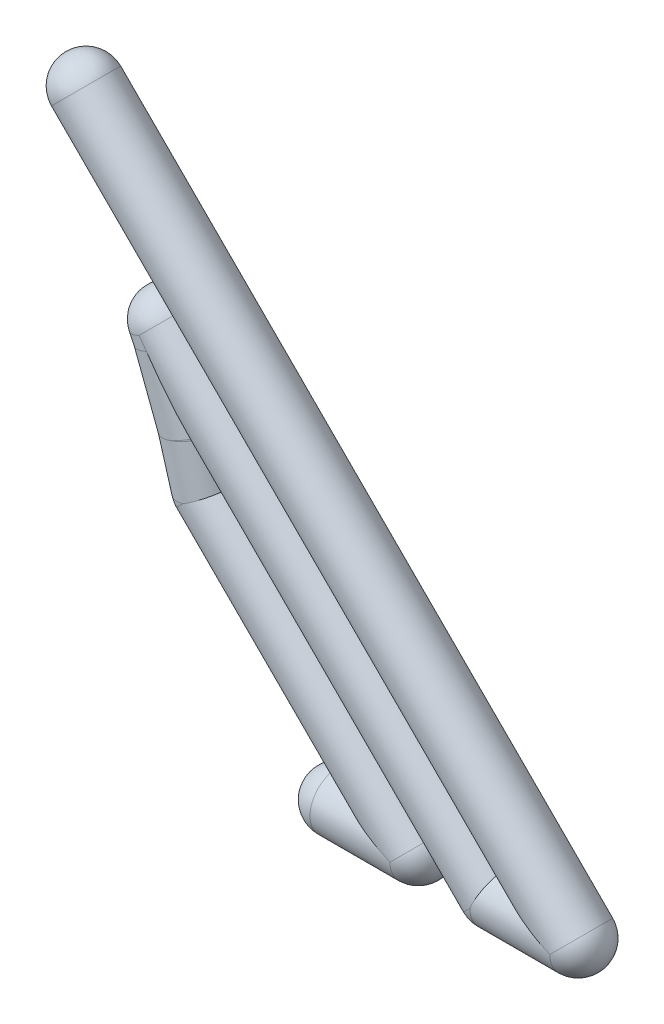
ISO-10303-21;
HEADER;
FILE_DESCRIPTION(('STEP AP214'),'2;1');
FILE_NAME('part.step','',(''),(''),'','','');
FILE_SCHEMA(('AUTOMOTIVE_DESIGN { 1 0 10303 214 1 1 1 1 }'));
ENDSEC;
DATA;
#1=APPLICATION_CONTEXT('core data for automotive mechanical design processes');
#2=APPLICATION_PROTOCOL_DEFINITION('international standard','automotive_design',2000,#1);
#3=PRODUCT_CONTEXT('',#1,'mechanical');
#4=PRODUCT('Part','Part','',(#3));
#5=PRODUCT_RELATED_PRODUCT_CATEGORY('part','',(#4));
#6=PRODUCT_DEFINITION_FORMATION('','',#4);
#7=PRODUCT_DEFINITION_CONTEXT('part definition',#1,'design');
#8=PRODUCT_DEFINITION('design','',#6,#7);
#9=PRODUCT_DEFINITION_SHAPE('','',#8);
#10=(LENGTH_UNIT() NAMED_UNIT(*) SI_UNIT(.MILLI.,.METRE.));
#11=(NAMED_UNIT(*) PLANE_ANGLE_UNIT() SI_UNIT($,.RADIAN.));
#12=(NAMED_UNIT(*) SI_UNIT($,.STERADIAN.) SOLID_ANGLE_UNIT());
#13=UNCERTAINTY_MEASURE_WITH_UNIT(LENGTH_MEASURE(1.E-05),#10,'distance_accuracy_value','');
#14=(GEOMETRIC_REPRESENTATION_CONTEXT(3) GLOBAL_UNCERTAINTY_ASSIGNED_CONTEXT((#13)) GLOBAL_UNIT_ASSIGNED_CONTEXT((#10,
#11,#12)) REPRESENTATION_CONTEXT('',''));
#15=CARTESIAN_POINT('',(0.,0.,0.));
#16=DIRECTION('',(0.,0.,1.));
#17=DIRECTION('',(1.,0.,0.));
#18=AXIS2_PLACEMENT_3D('',#15,#16,#17);
#19=CARTESIAN_POINT('',(11.603,-12.315,0.375));
#20=DIRECTION('',(1.,0.,0.));
#21=DIRECTION('',(0.,-1.,0.));
#22=AXIS2_PLACEMENT_3D('',#19,#20,#21);
#23=SPHERICAL_SURFACE('',#22,0.24);
#24=CARTESIAN_POINT('',(11.603,-12.315,0.375));
#25=DIRECTION('',(-0.707106781186547,0.707106781186548,0.));
#26=DIRECTION('',(-0.707106781186548,-0.707106781186547,0.));
#27=AXIS2_PLACEMENT_3D('',#24,#25,#26);
#28=SPHERICAL_SURFACE('',#27,0.24);
#29=CARTESIAN_POINT('',(11.603,-12.315,0.375));
#30=DIRECTION('',(-0.707106781186547,0.707106781186548,0.));
#31=DIRECTION('',(-0.707106781186548,-0.707106781186547,0.));
#32=AXIS2_PLACEMENT_3D('',#29,#30,#31);
#33=CIRCLE('',#32,0.24);
#34=CARTESIAN_POINT('',(11.4332943725152,-12.4847056274848,0.375));
#35=VERTEX_POINT('',#34);
#36=EDGE_CURVE('E88',#35,#35,#33,.F.);
#37=ORIENTED_EDGE('',*,*,#36,.F.);
#38=EDGE_LOOP('',(#37));
#39=FACE_BOUND('',#38,.T.);
#40=ADVANCED_FACE('F81',(#39),#28,.T.);
#41=CARTESIAN_POINT('',(15.78,-16.492,0.375));
#42=DIRECTION('',(-0.707106781186547,0.707106781186548,0.));
#43=DIRECTION('',(-0.707106781186548,-0.707106781186547,0.));
#44=AXIS2_PLACEMENT_3D('',#41,#42,#43);
#45=CYLINDRICAL_SURFACE('',#44,0.24);
#46=CARTESIAN_POINT('',(15.78,-16.492,0.375));
#47=DIRECTION('',(0.38268343236509,0.923879532511287,0.));
#48=DIRECTION('',(-0.923879532511287,0.38268343236509,0.));
#49=AXIS2_PLACEMENT_3D('',#46,#47,#48);
#50=ELLIPSE('',#49,0.627150223140661,0.24);
#51=CARTESIAN_POINT('',(15.78,-16.492,0.615));
#52=VERTEX_POINT('',#51);
#53=CARTESIAN_POINT('',(15.78,-16.492,0.135));
#54=VERTEX_POINT('',#53);
#55=EDGE_CURVE('E12',#52,#54,#50,.F.);
#56=ORIENTED_EDGE('',*,*,#55,.F.);
#57=CARTESIAN_POINT('',(15.78,-16.492,0.375));
#58=DIRECTION('',(-0.707106781186548,0.707106781186547,0.));
#59=DIRECTION('',(-0.707106781186547,-0.707106781186548,0.));
#60=AXIS2_PLACEMENT_3D('',#57,#58,#59);
#61=CIRCLE('',#60,0.24);
#62=EDGE_CURVE('E95',#52,#54,#61,.T.);
#63=ORIENTED_EDGE('',*,*,#62,.T.);
#64=EDGE_LOOP('',(#56,#63));
#65=FACE_BOUND('',#64,.T.);
#66=ORIENTED_EDGE('',*,*,#36,.T.);
#67=EDGE_LOOP('',(#66));
#68=FACE_BOUND('',#67,.T.);
#69=ADVANCED_FACE('F352',(#65,#68),#45,.T.);
#70=CARTESIAN_POINT('',(15.78,-16.492,0.375));
#71=DIRECTION('',(1.,0.,0.));
#72=DIRECTION('',(0.,-1.,0.));
#73=AXIS2_PLACEMENT_3D('',#70,#71,#72);
#74=SPHERICAL_SURFACE('',#73,0.24);
#75=ORIENTED_EDGE('',*,*,#62,.F.);
#76=CARTESIAN_POINT('',(15.78,-16.492,0.375));
#77=DIRECTION('',(1.,0.,0.));
#78=DIRECTION('',(0.,0.,-1.));
#79=AXIS2_PLACEMENT_3D('',#76,#77,#78);
#80=CIRCLE('',#79,0.24);
#81=EDGE_CURVE('E340',#54,#52,#80,.F.);
#82=ORIENTED_EDGE('',*,*,#81,.F.);
#83=EDGE_LOOP('',(#75,#82));
#84=FACE_BOUND('',#83,.T.);
#85=ADVANCED_FACE('F358',(#84),#74,.T.);
#86=CARTESIAN_POINT('',(15.101,-16.492,0.375));
#87=DIRECTION('',(1.,0.,0.));
#88=DIRECTION('',(0.,0.,-1.));
#89=AXIS2_PLACEMENT_3D('',#86,#87,#88);
#90=CYLINDRICAL_SURFACE('',#89,0.24);
#91=CARTESIAN_POINT('',(15.101,-16.492,0.375));
#92=DIRECTION('',(0.923879532511287,-0.38268343236509,0.));
#93=DIRECTION('',(0.38268343236509,0.923879532511287,0.));
#94=AXIS2_PLACEMENT_3D('',#91,#92,#93);
#95=ELLIPSE('',#94,0.259774128070175,0.24);
#96=CARTESIAN_POINT('',(15.101,-16.492,0.615));
#97=VERTEX_POINT('',#96);
#98=CARTESIAN_POINT('',(15.101,-16.492,0.135));
#99=VERTEX_POINT('',#98);
#100=EDGE_CURVE('E345',#97,#99,#95,.F.);
#101=ORIENTED_EDGE('',*,*,#100,.F.);
#102=CARTESIAN_POINT('',(15.101,-16.492,0.375));
#103=DIRECTION('',(1.,0.,0.));
#104=DIRECTION('',(0.,0.,-1.));
#105=AXIS2_PLACEMENT_3D('',#102,#103,#104);
#106=CIRCLE('',#105,0.24);
#107=EDGE_CURVE('E339',#97,#99,#106,.T.);
#108=ORIENTED_EDGE('',*,*,#107,.T.);
#109=EDGE_LOOP('',(#101,#108));
#110=FACE_BOUND('',#109,.T.);
#111=ORIENTED_EDGE('',*,*,#81,.T.);
#112=ORIENTED_EDGE('',*,*,#55,.T.);
#113=EDGE_LOOP('',(#111,#112));
#114=FACE_BOUND('',#113,.T.);
#115=ADVANCED_FACE('F362',(#110,#114),#90,.T.);
#116=CARTESIAN_POINT('',(15.101,-16.492,0.375));
#117=DIRECTION('',(1.,0.,0.));
#118=DIRECTION('',(0.,-1.,0.));
#119=AXIS2_PLACEMENT_3D('',#116,#117,#118);
#120=SPHERICAL_SURFACE('',#119,0.24);
#121=ORIENTED_EDGE('',*,*,#107,.F.);
#122=CARTESIAN_POINT('',(15.101,-16.492,0.375));
#123=DIRECTION('',(0.707106781186548,-0.707106781186547,0.));
#124=DIRECTION('',(0.707106781186547,0.707106781186548,0.));
#125=AXIS2_PLACEMENT_3D('',#122,#123,#124);
#126=CIRCLE('',#125,0.24);
#127=EDGE_CURVE('E229',#99,#97,#126,.F.);
#128=ORIENTED_EDGE('',*,*,#127,.F.);
#129=EDGE_LOOP('',(#121,#128));
#130=FACE_BOUND('',#129,.T.);
#131=ADVANCED_FACE('F367',(#130),#120,.T.);
#132=CARTESIAN_POINT('',(12.293,-13.684,0.375));
#133=DIRECTION('',(0.707106781186548,-0.707106781186547,0.));
#134=DIRECTION('',(0.707106781186547,0.707106781186548,0.));
#135=AXIS2_PLACEMENT_3D('',#132,#133,#134);
#136=CYLINDRICAL_SURFACE('',#135,0.24);
#137=CARTESIAN_POINT('',(14.9315482287431,-16.6614517712569,0.388122287750447));
#138=CARTESIAN_POINT('',(14.8750762374142,-16.6049958479422,0.387917976856971));
#139=CARTESIAN_POINT('',(14.8186041785029,-16.5485398545911,0.387704029631473));
#140=CARTESIAN_POINT('',(14.7054513690829,-16.4354192333862,0.387263843036514));
#141=CARTESIAN_POINT('',(14.6487706186599,-16.3787546056097,0.387037561159029));
#142=CARTESIAN_POINT('',(14.478339762828,-16.208372228883,0.386351621331153));
#143=CARTESIAN_POINT('',(14.3645899349614,-16.0946547580285,0.385886383658709));
#144=CARTESIAN_POINT('',(14.1371683858608,-15.8672979002828,0.384758742685581));
#145=CARTESIAN_POINT('',(14.0234966658242,-15.7536585145892,0.384096477956337));
#146=CARTESIAN_POINT('',(13.7973951645419,-15.5276213288395,0.383073425610083));
#147=CARTESIAN_POINT('',(13.6849653045821,-15.4152234500906,0.382709441510488));
#148=CARTESIAN_POINT('',(13.45976146334,-15.1900836691241,0.380109317611419));
#149=CARTESIAN_POINT('',(13.3469874126026,-15.0773416974711,0.377867857259473));
#150=CARTESIAN_POINT('',(13.2059833589703,-14.9363777530824,0.377917305846484));
#151=CARTESIAN_POINT('',(13.1777055776379,-14.9081080154938,0.378070801474246));
#152=CARTESIAN_POINT('',(13.1489610929394,-14.8793717072949,0.375470068229033));
#153=CARTESIAN_POINT('',(13.1485086663535,-14.8789194094038,0.375428440231718));
#154=CARTESIAN_POINT('',(13.1478428067681,-14.8782537392252,0.375329330243708));
#155=CARTESIAN_POINT('',(13.1476261233747,-14.8780371174684,0.375291011495398));
#156=CARTESIAN_POINT('',(13.1471902403786,-14.8776013584612,0.375228409359514));
#157=CARTESIAN_POINT('',(13.1469712543874,-14.8773824347616,0.375203785463772));
#158=CARTESIAN_POINT('',(13.1467735547008,-14.8771847913115,0.375078882046712));
#159=CARTESIAN_POINT('',(13.1467711905827,-14.8771824278659,0.375077371727318));
#160=CARTESIAN_POINT('',(13.1467664738125,-14.8771777124375,0.375074315793714));
#161=CARTESIAN_POINT('',(13.146764121163,-14.8771753604572,0.375072770172318));
#162=CARTESIAN_POINT('',(13.1467570765487,-14.8771683178467,0.375068032536357));
#163=CARTESIAN_POINT('',(13.1467524142363,-14.8771636568605,0.375064749720251));
#164=CARTESIAN_POINT('',(13.1467431130988,-14.8771543583688,0.375057643069673));
#165=CARTESIAN_POINT('',(13.1467384792103,-14.8771497257984,0.375053805918599));
#166=CARTESIAN_POINT('',(13.1467296514229,-14.8771409005221,0.375045242238543));
#167=CARTESIAN_POINT('',(13.1467254548195,-14.8771367051125,0.375040521752456));
#168=CARTESIAN_POINT('',(13.1467203244988,-14.8771315762511,0.375033307162306));
#169=CARTESIAN_POINT('',(13.1467190267829,-14.8771302789044,0.375031331293022));
#170=CARTESIAN_POINT('',(13.1467165770812,-14.8771278298995,0.375027195024072));
#171=CARTESIAN_POINT('',(13.1467154254772,-14.877126678623,0.375025034164695));
#172=CARTESIAN_POINT('',(13.1467133076084,-14.8771245613567,0.375020497333478));
#173=CARTESIAN_POINT('',(13.1467123436951,-14.8771235977176,0.37501811912103));
#174=CARTESIAN_POINT('',(13.1467107281527,-14.8771219826347,0.375013160361962));
#175=CARTESIAN_POINT('',(13.1467100750083,-14.8771213296762,0.375010580869919));
#176=CARTESIAN_POINT('',(13.1467093300799,-14.8771205849596,0.375006011804161));
#177=CARTESIAN_POINT('',(13.1467091329237,-14.8771203878595,0.3750040567046));
#178=CARTESIAN_POINT('',(13.1467089711055,-14.8771202260873,0.375000126074439));
#179=CARTESIAN_POINT('',(13.146709006547,-14.8771202615187,0.374998150535128));
#180=CARTESIAN_POINT('',(13.14670931751,-14.8771205723933,0.374994244354865));
#181=CARTESIAN_POINT('',(13.1467095923101,-14.8771208471153,0.374992313596891));
#182=CARTESIAN_POINT('',(13.1467103429324,-14.877121597524,0.374988533592562));
#183=CARTESIAN_POINT('',(13.1467108188649,-14.8771220733212,0.374986684391649));
#184=CARTESIAN_POINT('',(13.1467122511948,-14.8771235052436,0.37498209352165));
#185=CARTESIAN_POINT('',(13.1467133276119,-14.8771245813545,0.374979427073381));
#186=CARTESIAN_POINT('',(13.1467157523752,-14.8771270054281,0.374974356399019));
#187=CARTESIAN_POINT('',(13.146717101575,-14.8771283542441,0.374971953033475));
#188=CARTESIAN_POINT('',(13.1467220168944,-14.8771332681654,0.374964076804209));
#189=CARTESIAN_POINT('',(13.1467259965706,-14.8771372467094,0.374959123777026));
#190=CARTESIAN_POINT('',(13.1467344471684,-14.8771456949035,0.374950148115432));
#191=CARTESIAN_POINT('',(13.1467389212037,-14.8771501676661,0.3749461319391));
#192=CARTESIAN_POINT('',(13.1467602700502,-14.8771715104398,0.374928256485313));
#193=CARTESIAN_POINT('',(13.1467781893365,-14.877189424629,0.374916919257417));
#194=CARTESIAN_POINT('',(13.1468148713317,-14.8772260961897,0.374897677522705));
#195=CARTESIAN_POINT('',(13.1468336365081,-14.8772448560283,0.374889783887153));
#196=CARTESIAN_POINT('',(13.1470012760865,-14.8774124479209,0.374823181562309));
#197=CARTESIAN_POINT('',(13.1471545481204,-14.8775656763559,0.3747896406223));
#198=CARTESIAN_POINT('',(13.1479196883627,-14.8783305989505,0.37463945731144));
#199=CARTESIAN_POINT('',(13.1485339536009,-14.8789446894581,0.374573826002209));
#200=CARTESIAN_POINT('',(13.1516049869237,-14.8820148492115,0.374278312428002));
#201=CARTESIAN_POINT('',(13.1540670609565,-14.8844762228962,0.374145588736593));
#202=CARTESIAN_POINT('',(13.1663755225631,-14.8967811833048,0.373549215720243));
#203=CARTESIAN_POINT('',(13.1762222988036,-14.906625158585,0.373286917528214));
#204=CARTESIAN_POINT('',(13.2254570188469,-14.955845873588,0.37210546644178));
#205=CARTESIAN_POINT('',(13.2648535421154,-14.9952311903362,0.371576244967009));
#206=CARTESIAN_POINT('',(13.4618323480808,-15.1921539647834,0.369195627459563));
#207=CARTESIAN_POINT('',(13.6194092453457,-15.3496860385828,0.368140606235355));
#208=CARTESIAN_POINT('',(14.1618083090038,-15.8919308143571,0.364903948852689));
#209=CARTESIAN_POINT('',(14.5466399576362,-16.2766529958718,0.363291662857187));
#210=CARTESIAN_POINT('',(14.9314940955856,-16.6613976603133,0.361877999102051));
#211=CARTESIAN_POINT('',(14.9315211605413,-16.6614247175703,0.361877899686805));
#212=CARTESIAN_POINT('',(14.9315482254971,-16.6614517748273,0.361877800272542));
#213=B_SPLINE_CURVE_WITH_KNOTS('',3,(#137,#138,#139,#140,#141,#142,#143,#144,#145,#146,#147,
#148,#149,#150,#151,#152,#153,#154,#155,#156,#157,#158,#159,#160,#161,#162,#163,#164,#165,#166,
#167,#168,#169,#170,#171,#172,#173,#174,#175,#176,#177,#178,#179,#180,#181,#182,#183,#184,#185,
#186,#187,#188,#189,#190,#191,#192,#193,#194,#195,#196,#197,#198,#199,#200,#201,#202,#203,#204,
#205,#206,#207,#208,#209,#210,#211,#212),.UNSPECIFIED.,.F.,.F.,(4,2,2,2,2,2,2,2,2,2,2,2,2,2,2,2,
2,2,2,2,2,2,2,2,2,2,2,2,2,2,2,2,2,2,2,2,2,4),(0.,0.239557313620775,0.4800000057718,
0.962535040171978,1.44473150109493,1.92169038739399,2.40000551157326,2.52000957530604,
2.52192857969255,2.5228606812891,2.52376843269858,2.52377943542771,2.52379044041686,
2.52381252578302,2.52383527631846,2.52385787655869,2.5238659559146,2.5238740559658,
2.52388225175364,2.52389040716289,2.52389630391564,2.52390220329424,2.52390808495575,
2.52391396985406,2.52392312563574,2.52393231052351,2.52395461669478,2.52397707236449,
2.5240598162535,2.52414281950351,2.52479851037322,2.52741262182741,2.53786028606407,
2.57964229424701,2.74676175068568,3.4152310279806,5.04768733647496,5.04780214741451),.UNSPECIFIED.);
#214=CARTESIAN_POINT('',(14.5924517746651,-16.3224517815247,0.386810913372843));
#215=VERTEX_POINT('',#214);
#216=CARTESIAN_POINT('',(14.5924517746651,-16.3224517815246,0.363189086627545));
#217=VERTEX_POINT('',#216);
#218=EDGE_CURVE('E274',#215,#217,#213,.T.);
#219=ORIENTED_EDGE('',*,*,#218,.F.);
#220=CARTESIAN_POINT('',(14.592045490417,-16.3220460989788,0.363197724907535));
#221=CARTESIAN_POINT('',(14.5927855272339,-16.3227840181536,0.363170140908159));
#222=CARTESIAN_POINT('',(14.5935250497458,-16.3235265205875,0.363210366677329));
#223=CARTESIAN_POINT('',(14.594995381605,-16.3250122859691,0.363432793783975));
#224=CARTESIAN_POINT('',(14.5957260483224,-16.32575549314,0.363616297106092));
#225=CARTESIAN_POINT('',(14.5971582805426,-16.3272216029604,0.364132871563565));
#226=CARTESIAN_POINT('',(14.5978597845082,-16.3279444617284,0.36446624301562));
#227=CARTESIAN_POINT('',(14.5992097977937,-16.3293438923,0.365293972248114));
#228=CARTESIAN_POINT('',(14.5998584840049,-16.3300206172557,0.365787762481223));
#229=CARTESIAN_POINT('',(14.6008659689167,-16.3310771704037,0.366752257755144));
#230=CARTESIAN_POINT('',(14.6012482857421,-16.3314796541656,0.367173614955008));
#231=CARTESIAN_POINT('',(14.6019634712218,-16.3322348872765,0.368095949611167));
#232=CARTESIAN_POINT('',(14.6022963998581,-16.3325876969278,0.368596828930779));
#233=CARTESIAN_POINT('',(14.6028364990052,-16.3331614740865,0.369571473485295));
#234=CARTESIAN_POINT('',(14.6030555294907,-16.3333947307139,0.37003135364559));
#235=CARTESIAN_POINT('',(14.6034390462325,-16.333803785375,0.370997544589661));
#236=CARTESIAN_POINT('',(14.6036035625136,-16.3339796150372,0.371503829618169));
#237=CARTESIAN_POINT('',(14.6038678769652,-16.3342623690822,0.372556989367016));
#238=CARTESIAN_POINT('',(14.6039670960431,-16.3343686768547,0.373104180584878));
#239=CARTESIAN_POINT('',(14.6040894944871,-16.3344998481985,0.374216495353213));
#240=CARTESIAN_POINT('',(14.604112742793,-16.3345247856094,0.374781602175582));
#241=CARTESIAN_POINT('',(14.6040834231833,-16.3344933531136,0.375827166809444));
#242=CARTESIAN_POINT('',(14.6040410959016,-16.3344479654272,0.376308311473293));
#243=CARTESIAN_POINT('',(14.603902053636,-16.3342990069276,0.377253298338361));
#244=CARTESIAN_POINT('',(14.6038053331298,-16.334195430207,0.377717138777695));
#245=CARTESIAN_POINT('',(14.6035628929973,-16.3339361561504,0.378619296885689));
#246=CARTESIAN_POINT('',(14.603416895122,-16.3337801628627,0.379057452654832));
#247=CARTESIAN_POINT('',(14.6030835915636,-16.333424657855,0.379898745384636));
#248=CARTESIAN_POINT('',(14.6028962666699,-16.3332251258967,0.380301865937445));
#249=CARTESIAN_POINT('',(14.6023852454658,-16.3326819228862,0.381262213275289));
#250=CARTESIAN_POINT('',(14.6020402156491,-16.3323160880823,0.381795610600324));
#251=CARTESIAN_POINT('',(14.6012944812506,-16.3315283007031,0.382774873675971));
#252=CARTESIAN_POINT('',(14.6008936536281,-16.3311062241989,0.383220540579234));
#253=CARTESIAN_POINT('',(14.5998906543084,-16.3300543263403,0.384182392027064));
#254=CARTESIAN_POINT('',(14.5992701899838,-16.3294068801879,0.384660145973488));
#255=CARTESIAN_POINT('',(14.5979801473993,-16.328068892451,0.385467684084758));
#256=CARTESIAN_POINT('',(14.5973104438288,-16.3273782416293,0.38579707436404));
#257=CARTESIAN_POINT('',(14.5958828313928,-16.3259152556819,0.386339903932881));
#258=CARTESIAN_POINT('',(14.5951222767634,-16.3251409855006,0.386541020909745));
#259=CARTESIAN_POINT('',(14.5935896693635,-16.3235913952982,0.386785910200608));
#260=CARTESIAN_POINT('',(14.5928177612086,-16.3228161354843,0.386830954014258));
#261=CARTESIAN_POINT('',(14.5920454904172,-16.322046098979,0.386802275092592));
#262=B_SPLINE_CURVE_WITH_KNOTS('',3,(#220,#221,#222,#223,#224,#225,#226,#227,#228,#229,#230,
#231,#232,#233,#234,#235,#236,#237,#238,#239,#240,#241,#242,#243,#244,#245,#246,#247,#248,#249,
#250,#251,#252,#253,#254,#255,#256,#257,#258,#259,#260,#261),.UNSPECIFIED.,.F.,.F.,(4,2,2,2,2,2,
2,2,2,2,2,2,2,2,2,2,2,2,2,2,4),(0.,0.00313581071867892,0.00630045344736494,0.00947146618249383,
0.0126313801521141,0.0147157653910343,0.0167975980445447,0.0184719127986302,0.0201453038504478,
0.0218333423568615,0.0235198486232306,0.0249682471109119,0.0264167926715555,0.0278736583485676,
0.0293312026756919,0.0315181183628221,0.0337099351791593,0.0367417389363111,0.0397815449547719,
0.0430812645827186,0.0463540379649264),.UNSPECIFIED.);
#263=EDGE_CURVE('E267',#217,#215,#262,.T.);
#264=ORIENTED_EDGE('',*,*,#263,.F.);
#265=EDGE_LOOP('',(#219,#264));
#266=FACE_BOUND('',#265,.T.);
#267=CARTESIAN_POINT('',(12.293,-13.684,0.375));
#268=DIRECTION('',(0.816230722979718,0.577726065591649,0.));
#269=DIRECTION('',(0.57772606559165,-0.816230722979718,0.));
#270=AXIS2_PLACEMENT_3D('',#267,#268,#269);
#271=ELLIPSE('',#270,1.42308019762184,0.24);
#272=CARTESIAN_POINT('',(12.293,-13.684,0.135));
#273=VERTEX_POINT('',#272);
#274=CARTESIAN_POINT('',(12.3540833090224,-13.7703005435531,0.13566332178015));
#275=VERTEX_POINT('',#274);
#276=EDGE_CURVE('E234',#273,#275,#271,.F.);
#277=ORIENTED_EDGE('',*,*,#276,.F.);
#278=CARTESIAN_POINT('',(12.293,-13.684,0.375));
#279=DIRECTION('',(0.707106781186548,-0.707106781186547,0.));
#280=DIRECTION('',(0.707106781186547,0.707106781186548,0.));
#281=AXIS2_PLACEMENT_3D('',#278,#279,#280);
#282=CIRCLE('',#281,0.24);
#283=CARTESIAN_POINT('',(12.293,-13.684,0.615));
#284=VERTEX_POINT('',#283);
#285=EDGE_CURVE('E226',#273,#284,#282,.T.);
#286=ORIENTED_EDGE('',*,*,#285,.T.);
#287=CARTESIAN_POINT('',(12.3540833090224,-13.7703005435531,0.61433667821985));
#288=VERTEX_POINT('',#287);
#289=EDGE_CURVE('E232',#288,#284,#271,.F.);
#290=ORIENTED_EDGE('',*,*,#289,.F.);
#291=CARTESIAN_POINT('',(12.358378732383,-13.7782000000004,0.614133158023856));
#292=CARTESIAN_POINT('',(12.3575898776608,-13.7762532027038,0.614202378402398));
#293=CARTESIAN_POINT('',(12.3566494292699,-13.7743607316893,0.614255992869053));
#294=CARTESIAN_POINT('',(12.3544730089656,-13.7707604383413,0.614333670194881));
#295=CARTESIAN_POINT('',(12.3532377106063,-13.7690522078582,0.614357799651647));
#296=CARTESIAN_POINT('',(12.3504675017782,-13.7658776109057,0.614378525356139));
#297=CARTESIAN_POINT('',(12.3489308695726,-13.764412728164,0.614374958608206));
#298=CARTESIAN_POINT('',(12.3456227322374,-13.7617862987104,0.614339638904462));
#299=CARTESIAN_POINT('',(12.3438514554292,-13.7606244603426,0.614307913179885));
#300=CARTESIAN_POINT('',(12.3406383142769,-13.7588678962428,0.614226738118509));
#301=CARTESIAN_POINT('',(12.3392335192586,-13.758204473824,0.614184212101394));
#302=CARTESIAN_POINT('',(12.3377999999999,-13.7576212676172,0.614133158023873));
#303=B_SPLINE_CURVE_WITH_KNOTS('',3,(#291,#292,#293,#294,#295,#296,#297,#298,#299,#300,#301,
#302),.UNSPECIFIED.,.F.,.F.,(4,2,2,2,2,4),(0.,0.00630852478798068,0.0126027740571481,
0.0189340937292258,0.0252592973399009,0.0299085741015973),.UNSPECIFIED.);
#304=CARTESIAN_POINT('',(12.3549381491789,-13.771563503312,0.614315002899479));
#305=VERTEX_POINT('',#304);
#306=EDGE_CURVE('E182',#305,#288,#303,.T.);
#307=ORIENTED_EDGE('',*,*,#306,.F.);
#308=CARTESIAN_POINT('',(12.3079677419355,-13.6989677419355,0.375));
#309=DIRECTION('',(0.839587673039878,0.543224207192098,0.));
#310=DIRECTION('',(0.543224207192098,-0.839587673039878,0.));
#311=AXIS2_PLACEMENT_3D('',#308,#309,#310);
#312=ELLIPSE('',#311,1.14525335975074,0.24);
#313=CARTESIAN_POINT('',(12.6818138404038,-14.2767707406466,0.566835323706767));
#314=VERTEX_POINT('',#313);
#315=EDGE_CURVE('E173',#314,#305,#312,.F.);
#316=ORIENTED_EDGE('',*,*,#315,.F.);
#317=CARTESIAN_POINT('',(12.7086260595514,-14.3282,0.552417521327217));
#318=CARTESIAN_POINT('',(12.7038543222743,-14.3165814709501,0.556799088757638));
#319=CARTESIAN_POINT('',(12.6982878953596,-14.304959071408,0.560366008247214));
#320=CARTESIAN_POINT('',(12.6856926132302,-14.2824359690216,0.56593812019617));
#321=CARTESIAN_POINT('',(12.6786926482766,-14.2715259047742,0.567970924020544));
#322=CARTESIAN_POINT('',(12.6685671643629,-14.25792615334,0.56974891912929));
#323=CARTESIAN_POINT('',(12.6661275124618,-14.2547901128401,0.570102340179576));
#324=CARTESIAN_POINT('',(12.6610968672829,-14.2486001109741,0.570687430124372));
#325=CARTESIAN_POINT('',(12.6585050896472,-14.2455467202807,0.570918392554666));
#326=CARTESIAN_POINT('',(12.6558461067656,-14.2425477374404,0.571087826945467));
#327=B_SPLINE_CURVE_WITH_KNOTS('',3,(#317,#318,#319,#320,#321,#322,#323,#324,#325,#326),
.UNSPECIFIED.,.F.,.F.,(4,2,2,2,4),(0.,0.0399019347356475,0.0790673526131979,0.0910298770207343,
0.103060682377107),.UNSPECIFIED.);
#328=CARTESIAN_POINT('',(12.6881826974913,-14.2870674243146,0.564715497987964));
#329=VERTEX_POINT('',#328);
#330=EDGE_CURVE('E305',#329,#314,#327,.T.);
#331=ORIENTED_EDGE('',*,*,#330,.F.);
#332=CARTESIAN_POINT('',(12.3877612456747,-13.7787612456747,0.375));
#333=DIRECTION('',(0.860882975590021,0.508803009365385,0.));
#334=DIRECTION('',(0.508803009365385,-0.860882975590021,0.));
#335=AXIS2_PLACEMENT_3D('',#332,#333,#334);
#336=ELLIPSE('',#335,0.964017517409638,0.24);
#337=CARTESIAN_POINT('',(12.6881826974913,-14.2870674243146,0.185284502012036));
#338=VERTEX_POINT('',#337);
#339=EDGE_CURVE('E309',#338,#329,#336,.F.);
#340=ORIENTED_EDGE('',*,*,#339,.F.);
#341=CARTESIAN_POINT('',(12.6558461067498,-14.2425477374503,0.178912173068888));
#342=CARTESIAN_POINT('',(12.6646978410658,-14.2524772985985,0.179481697330987));
#343=CARTESIAN_POINT('',(12.6727600894574,-14.2630633000527,0.180714626647278));
#344=CARTESIAN_POINT('',(12.6871697537034,-14.2848337716999,0.184583930944721));
#345=CARTESIAN_POINT('',(12.6935453648575,-14.2960040804878,0.187194704906666));
#346=CARTESIAN_POINT('',(12.7008676617181,-14.310767195573,0.191577406245275));
#347=CARTESIAN_POINT('',(12.7025093052538,-14.3142341491451,0.192672428941642));
#348=CARTESIAN_POINT('',(12.7056650053207,-14.3212005989187,0.195013380652887));
#349=CARTESIAN_POINT('',(12.7071783021863,-14.3247001689005,0.196260114411259));
#350=CARTESIAN_POINT('',(12.7086260595615,-14.3281999999976,0.1975824786641));
#351=B_SPLINE_CURVE_WITH_KNOTS('',3,(#341,#342,#343,#344,#345,#346,#347,#348,#349,#350),
.UNSPECIFIED.,.F.,.F.,(4,2,2,2,4),(0.,0.0398896149687637,0.0790628830051207,0.0910271072460838,
0.103057814236885),.UNSPECIFIED.);
#352=CARTESIAN_POINT('',(12.6818138404038,-14.2767707406466,0.183164676293233));
#353=VERTEX_POINT('',#352);
#354=EDGE_CURVE('E261',#353,#338,#351,.T.);
#355=ORIENTED_EDGE('',*,*,#354,.F.);
#356=CARTESIAN_POINT('',(12.3549381491789,-13.771563503312,0.135684997100521));
#357=VERTEX_POINT('',#356);
#358=EDGE_CURVE('E260',#357,#353,#312,.F.);
#359=ORIENTED_EDGE('',*,*,#358,.F.);
#360=CARTESIAN_POINT('',(12.3377999999999,-13.7576212676171,0.135866841976132));
#361=CARTESIAN_POINT('',(12.3397467972965,-13.7584101223393,0.135797621597592));
#362=CARTESIAN_POINT('',(12.341639268311,-13.7593505707303,0.135744007130939));
#363=CARTESIAN_POINT('',(12.345239561659,-13.7615269910346,0.135666329805114));
#364=CARTESIAN_POINT('',(12.346947792142,-13.762762289394,0.13564220034835));
#365=CARTESIAN_POINT('',(12.3501223890945,-13.7655324982221,0.135621474643861));
#366=CARTESIAN_POINT('',(12.3515872718362,-13.7670691304276,0.135625041391795));
#367=CARTESIAN_POINT('',(12.3542137012898,-13.7703772677628,0.135660361095543));
#368=CARTESIAN_POINT('',(12.3553755396576,-13.7721485445711,0.135692086820121));
#369=CARTESIAN_POINT('',(12.3571321037574,-13.7753616857235,0.1357732618815));
#370=CARTESIAN_POINT('',(12.3577955261761,-13.7767664807417,0.135815787898617));
#371=CARTESIAN_POINT('',(12.358378732383,-13.7782000000004,0.135866841976139));
#372=B_SPLINE_CURVE_WITH_KNOTS('',3,(#360,#361,#362,#363,#364,#365,#366,#367,#368,#369,#370,
#371),.UNSPECIFIED.,.F.,.F.,(4,2,2,2,2,4),(0.,0.00630852478797743,0.0126027740571425,
0.0189340937292168,0.0252592973398864,0.0299085741015978),.UNSPECIFIED.);
#373=EDGE_CURVE('E254',#275,#357,#372,.T.);
#374=ORIENTED_EDGE('',*,*,#373,.F.);
#375=EDGE_LOOP('',(#277,#286,#290,#307,#316,#331,#340,#355,#359,#374));
#376=FACE_BOUND('',#375,.T.);
#377=ORIENTED_EDGE('',*,*,#127,.T.);
#378=ORIENTED_EDGE('',*,*,#100,.T.);
#379=EDGE_LOOP('',(#377,#378));
#380=FACE_BOUND('',#379,.T.);
#381=ADVANCED_FACE('F242',(#266,#376,#380),#136,.T.);
#382=CARTESIAN_POINT('',(12.338,-13.778,0.375));
#383=DIRECTION('',(1.,0.,0.));
#384=DIRECTION('',(0.,-1.,0.));
#385=AXIS2_PLACEMENT_3D('',#382,#383,#384);
#386=SPHERICAL_SURFACE('',#385,0.24);
#387=CARTESIAN_POINT('',(12.338,-13.778,0.375));
#388=DIRECTION('',(-0.355217760623575,0.934783580588348,0.));
#389=DIRECTION('',(-0.934783580588348,-0.355217760623575,0.));
#390=AXIS2_PLACEMENT_3D('',#387,#388,#389);
#391=CIRCLE('',#390,0.24);
#392=CARTESIAN_POINT('',(12.338,-13.778,0.615));
#393=VERTEX_POINT('',#392);
#394=EDGE_CURVE('E164',#305,#393,#391,.F.);
#395=ORIENTED_EDGE('',*,*,#394,.F.);
#396=ORIENTED_EDGE('',*,*,#306,.T.);
#397=CARTESIAN_POINT('',(12.338,-13.778,0.375));
#398=DIRECTION('',(-0.431794997855547,0.901971773298327,0.));
#399=DIRECTION('',(-0.901971773298327,-0.431794997855547,0.));
#400=AXIS2_PLACEMENT_3D('',#397,#398,#399);
#401=CIRCLE('',#400,0.240000000000001);
#402=EDGE_CURVE('E180',#393,#288,#401,.T.);
#403=ORIENTED_EDGE('',*,*,#402,.F.);
#404=EDGE_LOOP('',(#395,#396,#403));
#405=FACE_BOUND('',#404,.T.);
#406=ADVANCED_FACE('F181',(#405),#386,.T.);
#407=CARTESIAN_POINT('',(12.547,-14.328,0.375));
#408=DIRECTION('',(1.,0.,0.));
#409=DIRECTION('',(0.,-1.,0.));
#410=AXIS2_PLACEMENT_3D('',#407,#408,#409);
#411=SPHERICAL_SURFACE('',#410,0.24);
#412=CARTESIAN_POINT('',(12.547,-14.328,0.375));
#413=DIRECTION('',(-0.355217760623578,0.934783580588347,0.));
#414=DIRECTION('',(-0.934783580588347,-0.355217760623578,0.));
#415=AXIS2_PLACEMENT_3D('',#412,#413,#414);
#416=CIRCLE('',#415,0.24);
#417=CARTESIAN_POINT('',(12.547,-14.328,0.135));
#418=VERTEX_POINT('',#417);
#419=EDGE_CURVE('E219',#353,#418,#416,.T.);
#420=ORIENTED_EDGE('',*,*,#419,.F.);
#421=ORIENTED_EDGE('',*,*,#354,.T.);
#422=CARTESIAN_POINT('',(12.547,-14.328,0.375));
#423=DIRECTION('',(-0.278459146863924,0.960448074352703,0.));
#424=DIRECTION('',(-0.960448074352703,-0.278459146863924,0.));
#425=AXIS2_PLACEMENT_3D('',#422,#423,#424);
#426=CIRCLE('',#425,0.24);
#427=EDGE_CURVE('E216',#418,#338,#426,.F.);
#428=ORIENTED_EDGE('',*,*,#427,.F.);
#429=EDGE_LOOP('',(#420,#421,#428));
#430=FACE_BOUND('',#429,.T.);
#431=ADVANCED_FACE('F301',(#430),#411,.T.);
#432=CARTESIAN_POINT('',(12.293,-13.684,0.375));
#433=DIRECTION('',(1.,0.,0.));
#434=DIRECTION('',(0.,-1.,0.));
#435=AXIS2_PLACEMENT_3D('',#432,#433,#434);
#436=SPHERICAL_SURFACE('',#435,0.24);
#437=ORIENTED_EDGE('',*,*,#285,.F.);
#438=CARTESIAN_POINT('',(12.293,-13.684,0.375));
#439=DIRECTION('',(-0.431794997855573,0.901971773298314,0.));
#440=DIRECTION('',(-0.901971773298314,-0.431794997855574,0.));
#441=AXIS2_PLACEMENT_3D('',#438,#439,#440);
#442=CIRCLE('',#441,0.24);
#443=EDGE_CURVE('E224',#284,#273,#442,.F.);
#444=ORIENTED_EDGE('',*,*,#443,.F.);
#445=EDGE_LOOP('',(#437,#444));
#446=FACE_BOUND('',#445,.T.);
#447=ADVANCED_FACE('F249',(#446),#436,.T.);
#448=CARTESIAN_POINT('',(12.338,-13.778,0.135));
#449=VERTEX_POINT('',#448);
#450=EDGE_CURVE('E186',#275,#449,#401,.T.);
#451=ORIENTED_EDGE('',*,*,#450,.F.);
#452=ORIENTED_EDGE('',*,*,#373,.T.);
#453=EDGE_CURVE('E176',#449,#357,#391,.F.);
#454=ORIENTED_EDGE('',*,*,#453,.F.);
#455=EDGE_LOOP('',(#451,#452,#454));
#456=FACE_BOUND('',#455,.T.);
#457=ADVANCED_FACE('F245',(#456),#386,.T.);
#458=CARTESIAN_POINT('',(12.547,-14.328,0.375));
#459=DIRECTION('',(-0.355217760623575,0.934783580588348,0.));
#460=DIRECTION('',(-0.934783580588348,-0.355217760623575,0.));
#461=AXIS2_PLACEMENT_3D('',#458,#459,#460);
#462=CYLINDRICAL_SURFACE('',#461,0.24);
#463=ORIENTED_EDGE('',*,*,#453,.T.);
#464=ORIENTED_EDGE('',*,*,#358,.T.);
#465=ORIENTED_EDGE('',*,*,#419,.T.);
#466=CARTESIAN_POINT('',(12.547,-14.328,0.375));
#467=DIRECTION('',(-0.31709820612986,0.94839270751584,0.));
#468=DIRECTION('',(-0.94839270751584,-0.31709820612986,0.));
#469=AXIS2_PLACEMENT_3D('',#466,#467,#468);
#470=ELLIPSE('',#469,0.240196758227828,0.24);
#471=CARTESIAN_POINT('',(12.547,-14.328,0.615));
#472=VERTEX_POINT('',#471);
#473=EDGE_CURVE('E221',#472,#418,#470,.F.);
#474=ORIENTED_EDGE('',*,*,#473,.F.);
#475=EDGE_CURVE('E177',#472,#314,#416,.T.);
#476=ORIENTED_EDGE('',*,*,#475,.T.);
#477=ORIENTED_EDGE('',*,*,#315,.T.);
#478=ORIENTED_EDGE('',*,*,#394,.T.);
#479=CARTESIAN_POINT('',(12.338,-13.778,0.375));
#480=DIRECTION('',(-0.393848224798144,0.919175486957388,0.));
#481=DIRECTION('',(0.919175486957388,0.393848224798144,0.));
#482=AXIS2_PLACEMENT_3D('',#479,#480,#481);
#483=ELLIPSE('',#482,0.240208492005175,0.24);
#484=EDGE_CURVE('E169',#449,#393,#483,.T.);
#485=ORIENTED_EDGE('',*,*,#484,.F.);
#486=EDGE_LOOP('',(#463,#464,#465,#474,#476,#477,#478,#485));
#487=FACE_BOUND('',#486,.T.);
#488=ADVANCED_FACE('F167',(#487),#462,.T.);
#489=EDGE_CURVE('E215',#329,#472,#426,.F.);
#490=ORIENTED_EDGE('',*,*,#489,.F.);
#491=ORIENTED_EDGE('',*,*,#330,.T.);
#492=ORIENTED_EDGE('',*,*,#475,.F.);
#493=EDGE_LOOP('',(#490,#491,#492));
#494=FACE_BOUND('',#493,.T.);
#495=ADVANCED_FACE('F296',(#494),#411,.T.);
#496=CARTESIAN_POINT('',(12.665,-14.735,0.375));
#497=DIRECTION('',(1.,0.,0.));
#498=DIRECTION('',(0.,-1.,0.));
#499=AXIS2_PLACEMENT_3D('',#496,#497,#498);
#500=SPHERICAL_SURFACE('',#499,0.24);
#501=CARTESIAN_POINT('',(12.665,-14.735,0.375));
#502=DIRECTION('',(-0.278459146863945,0.960448074352697,0.));
#503=DIRECTION('',(-0.960448074352697,-0.278459146863945,0.));
#504=AXIS2_PLACEMENT_3D('',#501,#502,#503);
#505=CIRCLE('',#504,0.239999999999999);
#506=CARTESIAN_POINT('',(12.665,-14.735,0.135));
#507=VERTEX_POINT('',#506);
#508=CARTESIAN_POINT('',(12.665,-14.735,0.615));
#509=VERTEX_POINT('',#508);
#510=EDGE_CURVE('E191',#507,#509,#505,.T.);
#511=ORIENTED_EDGE('',*,*,#510,.F.);
#512=CARTESIAN_POINT('',(12.665,-14.735,0.375));
#513=DIRECTION('',(-0.707307920921512,0.706905584220191,0.));
#514=DIRECTION('',(-0.706905584220191,-0.707307920921512,0.));
#515=AXIS2_PLACEMENT_3D('',#512,#513,#514);
#516=CIRCLE('',#515,0.24);
#517=EDGE_CURVE('E209',#509,#507,#516,.F.);
#518=ORIENTED_EDGE('',*,*,#517,.F.);
#519=EDGE_LOOP('',(#511,#518));
#520=FACE_BOUND('',#519,.T.);
#521=ADVANCED_FACE('F299',(#520),#500,.T.);
#522=CARTESIAN_POINT('',(14.423,-16.492,0.375));
#523=DIRECTION('',(-0.707307920921512,0.706905584220191,0.));
#524=DIRECTION('',(-0.706905584220191,-0.707307920921512,0.));
#525=AXIS2_PLACEMENT_3D('',#522,#523,#524);
#526=CYLINDRICAL_SURFACE('',#525,0.24);
#527=CARTESIAN_POINT('',(12.665,-14.735,0.375));
#528=DIRECTION('',(-0.508925462674273,0.860810590921009,0.));
#529=DIRECTION('',(-0.86081059092101,-0.508925462674273,0.));
#530=AXIS2_PLACEMENT_3D('',#527,#528,#529);
#531=ELLIPSE('',#530,0.247811303569356,0.24);
#532=EDGE_CURVE('E194',#509,#507,#531,.T.);
#533=ORIENTED_EDGE('',*,*,#532,.F.);
#534=ORIENTED_EDGE('',*,*,#517,.T.);
#535=EDGE_LOOP('',(#533,#534));
#536=FACE_BOUND('',#535,.T.);
#537=CARTESIAN_POINT('',(14.423,-16.492,0.375));
#538=DIRECTION('',(-0.70730792092151,0.706905584220192,0.));
#539=DIRECTION('',(-0.706905584220192,-0.70730792092151,0.));
#540=AXIS2_PLACEMENT_3D('',#537,#538,#539);
#541=CIRCLE('',#540,0.24);
#542=CARTESIAN_POINT('',(14.423,-16.492,0.615));
#543=VERTEX_POINT('',#542);
#544=EDGE_CURVE('E206',#543,#215,#541,.T.);
#545=ORIENTED_EDGE('',*,*,#544,.T.);
#546=ORIENTED_EDGE('',*,*,#218,.T.);
#547=CARTESIAN_POINT('',(14.423,-16.492,0.135));
#548=VERTEX_POINT('',#547);
#549=EDGE_CURVE('E205',#217,#548,#541,.T.);
#550=ORIENTED_EDGE('',*,*,#549,.T.);
#551=CARTESIAN_POINT('',(14.423,-16.492,0.375));
#552=DIRECTION('',(0.382552008933745,0.92393395892821,0.));
#553=DIRECTION('',(-0.92393395892821,0.382552008933745,0.));
#554=AXIS2_PLACEMENT_3D('',#551,#552,#553);
#555=ELLIPSE('',#554,0.627365676810669,0.24);
#556=EDGE_CURVE('E212',#543,#548,#555,.F.);
#557=ORIENTED_EDGE('',*,*,#556,.F.);
#558=EDGE_LOOP('',(#545,#546,#550,#557));
#559=FACE_BOUND('',#558,.T.);
#560=ADVANCED_FACE('F286',(#536,#559),#526,.T.);
#561=CARTESIAN_POINT('',(14.423,-16.492,0.375));
#562=DIRECTION('',(1.,0.,0.));
#563=DIRECTION('',(0.,-1.,0.));
#564=AXIS2_PLACEMENT_3D('',#561,#562,#563);
#565=SPHERICAL_SURFACE('',#564,0.24);
#566=ORIENTED_EDGE('',*,*,#549,.F.);
#567=ORIENTED_EDGE('',*,*,#263,.T.);
#568=ORIENTED_EDGE('',*,*,#544,.F.);
#569=CARTESIAN_POINT('',(14.423,-16.492,0.375));
#570=DIRECTION('',(1.,0.,0.));
#571=DIRECTION('',(0.,0.,-1.));
#572=AXIS2_PLACEMENT_3D('',#569,#570,#571);
#573=CIRCLE('',#572,0.24);
#574=EDGE_CURVE('E202',#543,#548,#573,.T.);
#575=ORIENTED_EDGE('',*,*,#574,.T.);
#576=EDGE_LOOP('',(#566,#567,#568,#575));
#577=FACE_BOUND('',#576,.T.);
#578=ADVANCED_FACE('F280',(#577),#565,.T.);
#579=CARTESIAN_POINT('',(13.744,-16.492,0.375));
#580=DIRECTION('',(1.,0.,0.));
#581=DIRECTION('',(0.,0.,-1.));
#582=AXIS2_PLACEMENT_3D('',#579,#580,#581);
#583=CYLINDRICAL_SURFACE('',#582,0.24);
#584=ORIENTED_EDGE('',*,*,#574,.F.);
#585=ORIENTED_EDGE('',*,*,#556,.T.);
#586=EDGE_LOOP('',(#584,#585));
#587=FACE_BOUND('',#586,.T.);
#588=CARTESIAN_POINT('',(13.744,-16.492,0.375));
#589=DIRECTION('',(1.,0.,0.));
#590=DIRECTION('',(0.,0.,-1.));
#591=AXIS2_PLACEMENT_3D('',#588,#589,#590);
#592=CIRCLE('',#591,0.24);
#593=CARTESIAN_POINT('',(13.744,-16.492,0.135));
#594=VERTEX_POINT('',#593);
#595=EDGE_CURVE('E199',#594,#594,#592,.T.);
#596=ORIENTED_EDGE('',*,*,#595,.T.);
#597=EDGE_LOOP('',(#596));
#598=FACE_BOUND('',#597,.T.);
#599=ADVANCED_FACE('F285',(#587,#598),#583,.T.);
#600=CARTESIAN_POINT('',(13.744,-16.492,0.375));
#601=DIRECTION('',(1.,0.,0.));
#602=DIRECTION('',(0.,-1.,0.));
#603=AXIS2_PLACEMENT_3D('',#600,#601,#602);
#604=SPHERICAL_SURFACE('',#603,0.24);
#605=ORIENTED_EDGE('',*,*,#595,.F.);
#606=EDGE_LOOP('',(#605));
#607=FACE_BOUND('',#606,.T.);
#608=ADVANCED_FACE('F292',(#607),#604,.T.);
#609=CARTESIAN_POINT('',(12.665,-14.735,0.375));
#610=DIRECTION('',(-0.278459146863924,0.960448074352703,0.));
#611=DIRECTION('',(-0.960448074352703,-0.278459146863924,0.));
#612=AXIS2_PLACEMENT_3D('',#609,#610,#611);
#613=CYLINDRICAL_SURFACE('',#612,0.239999999999999);
#614=ORIENTED_EDGE('',*,*,#427,.T.);
#615=ORIENTED_EDGE('',*,*,#339,.T.);
#616=ORIENTED_EDGE('',*,*,#489,.T.);
#617=ORIENTED_EDGE('',*,*,#473,.T.);
#618=EDGE_LOOP('',(#614,#615,#616,#617));
#619=FACE_BOUND('',#618,.T.);
#620=ORIENTED_EDGE('',*,*,#510,.T.);
#621=ORIENTED_EDGE('',*,*,#532,.T.);
#622=EDGE_LOOP('',(#620,#621));
#623=FACE_BOUND('',#622,.T.);
#624=ADVANCED_FACE('F288',(#619,#623),#613,.T.);
#625=CARTESIAN_POINT('',(12.338,-13.778,0.375));
#626=DIRECTION('',(-0.431794997855573,0.901971773298314,0.));
#627=DIRECTION('',(-0.901971773298314,-0.431794997855574,0.));
#628=AXIS2_PLACEMENT_3D('',#625,#626,#627);
#629=CYLINDRICAL_SURFACE('',#628,0.240000000000001);
#630=ORIENTED_EDGE('',*,*,#443,.T.);
#631=ORIENTED_EDGE('',*,*,#276,.T.);
#632=ORIENTED_EDGE('',*,*,#450,.T.);
#633=ORIENTED_EDGE('',*,*,#484,.T.);
#634=ORIENTED_EDGE('',*,*,#402,.T.);
#635=ORIENTED_EDGE('',*,*,#289,.T.);
#636=EDGE_LOOP('',(#630,#631,#632,#633,#634,#635));
#637=FACE_BOUND('',#636,.T.);
#638=ADVANCED_FACE('F189',(#637),#629,.T.);
#639=CLOSED_SHELL('',(#40,#69,#85,#115,#131,#381,#406,#431,#447,#457,#488,#495,#521,#560,#578,
#599,#608,#624,#638));
#640=MANIFOLD_SOLID_BREP('B2',#639);
#641=ADVANCED_BREP_SHAPE_REPRESENTATION('',(#18,#640),#14);
#642=SHAPE_DEFINITION_REPRESENTATION(#9,#641);
ENDSEC;
END-ISO-10303-21;
